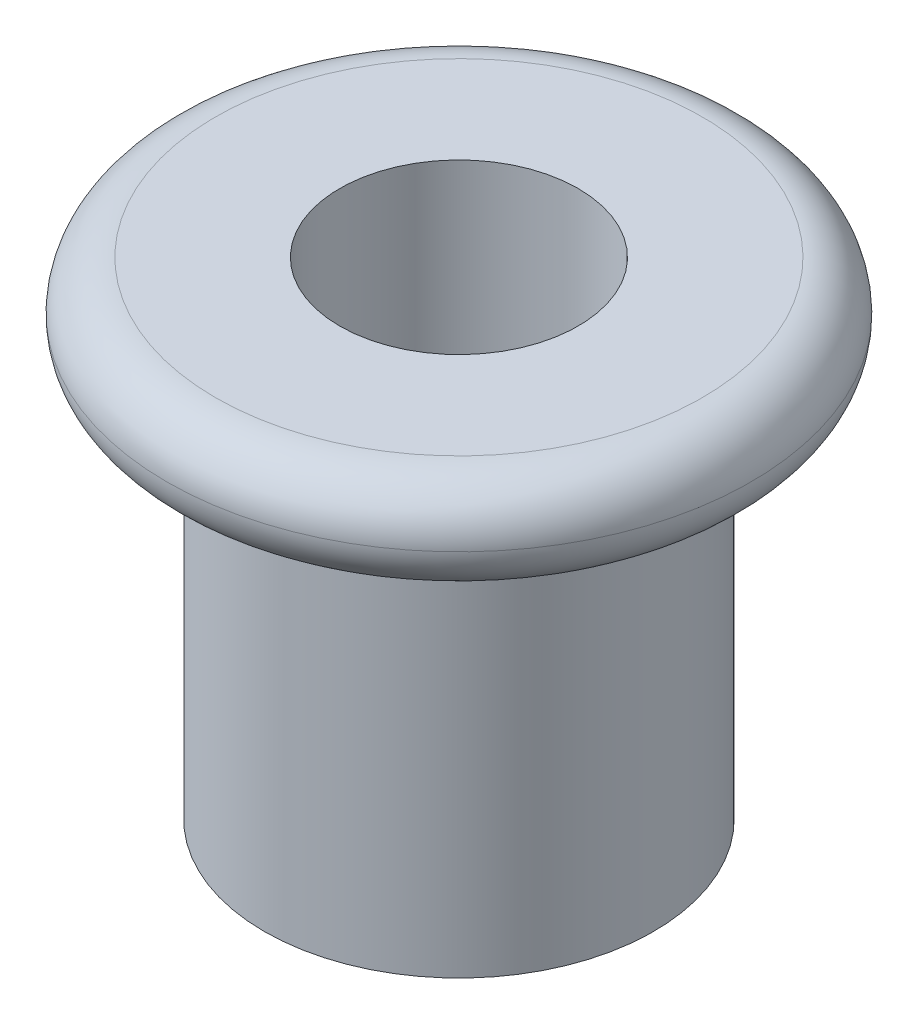
ISO-10303-21;
HEADER;
FILE_DESCRIPTION(('STEP AP214'),'2;1');
FILE_NAME('part.step','',(''),(''),'','','');
FILE_SCHEMA(('AUTOMOTIVE_DESIGN { 1 0 10303 214 1 1 1 1 }'));
ENDSEC;
DATA;
#1=APPLICATION_CONTEXT('core data for automotive mechanical design processes');
#2=APPLICATION_PROTOCOL_DEFINITION('international standard','automotive_design',2000,#1);
#3=PRODUCT_CONTEXT('',#1,'mechanical');
#4=PRODUCT('Part','Part','',(#3));
#5=PRODUCT_RELATED_PRODUCT_CATEGORY('part','',(#4));
#6=PRODUCT_DEFINITION_FORMATION('','',#4);
#7=PRODUCT_DEFINITION_CONTEXT('part definition',#1,'design');
#8=PRODUCT_DEFINITION('design','',#6,#7);
#9=PRODUCT_DEFINITION_SHAPE('','',#8);
#10=(LENGTH_UNIT() NAMED_UNIT(*) SI_UNIT(.MILLI.,.METRE.));
#11=(NAMED_UNIT(*) PLANE_ANGLE_UNIT() SI_UNIT($,.RADIAN.));
#12=(NAMED_UNIT(*) SI_UNIT($,.STERADIAN.) SOLID_ANGLE_UNIT());
#13=UNCERTAINTY_MEASURE_WITH_UNIT(LENGTH_MEASURE(1.E-05),#10,'distance_accuracy_value','');
#14=(GEOMETRIC_REPRESENTATION_CONTEXT(3) GLOBAL_UNCERTAINTY_ASSIGNED_CONTEXT((#13)) GLOBAL_UNIT_ASSIGNED_CONTEXT((#10,
#11,#12)) REPRESENTATION_CONTEXT('',''));
#15=CARTESIAN_POINT('',(0.,0.,0.));
#16=DIRECTION('',(0.,0.,1.));
#17=DIRECTION('',(1.,0.,0.));
#18=AXIS2_PLACEMENT_3D('',#15,#16,#17);
#19=CARTESIAN_POINT('',(0.,0.,0.));
#20=DIRECTION('',(0.,1.,0.));
#21=DIRECTION('',(0.,0.,1.));
#22=AXIS2_PLACEMENT_3D('',#19,#20,#21);
#23=PLANE('',#22);
#24=CARTESIAN_POINT('',(0.,0.,0.));
#25=DIRECTION('',(0.,1.,0.));
#26=DIRECTION('',(0.,0.,1.));
#27=AXIS2_PLACEMENT_3D('',#24,#25,#26);
#28=CIRCLE('',#27,3.45);
#29=CARTESIAN_POINT('',(0.,0.,3.45));
#30=VERTEX_POINT('',#29);
#31=EDGE_CURVE('E37',#30,#30,#28,.T.);
#32=ORIENTED_EDGE('',*,*,#31,.T.);
#33=EDGE_LOOP('',(#32));
#34=FACE_BOUND('',#33,.T.);
#35=CARTESIAN_POINT('',(0.,0.,0.));
#36=DIRECTION('',(0.,1.,0.));
#37=DIRECTION('',(0.,0.,1.));
#38=AXIS2_PLACEMENT_3D('',#35,#36,#37);
#39=CIRCLE('',#38,4.);
#40=CARTESIAN_POINT('',(0.,0.,4.));
#41=VERTEX_POINT('',#40);
#42=EDGE_CURVE('E50',#41,#41,#39,.T.);
#43=ORIENTED_EDGE('',*,*,#42,.F.);
#44=EDGE_LOOP('',(#43));
#45=FACE_BOUND('',#44,.T.);
#46=ADVANCED_FACE('F30',(#34,#45),#23,.F.);
#47=CARTESIAN_POINT('',(0.,8.,0.));
#48=DIRECTION('',(0.,-1.,0.));
#49=DIRECTION('',(0.,0.,-1.));
#50=AXIS2_PLACEMENT_3D('',#47,#48,#49);
#51=CYLINDRICAL_SURFACE('',#50,4.);
#52=CARTESIAN_POINT('',(0.,8.,0.));
#53=DIRECTION('',(0.,1.,0.));
#54=DIRECTION('',(0.,0.,1.));
#55=AXIS2_PLACEMENT_3D('',#52,#53,#54);
#56=CIRCLE('',#55,4.);
#57=CARTESIAN_POINT('',(0.,8.,4.));
#58=VERTEX_POINT('',#57);
#59=EDGE_CURVE('E55',#58,#58,#56,.T.);
#60=ORIENTED_EDGE('',*,*,#59,.F.);
#61=EDGE_LOOP('',(#60));
#62=FACE_BOUND('',#61,.T.);
#63=ORIENTED_EDGE('',*,*,#42,.T.);
#64=EDGE_LOOP('',(#63));
#65=FACE_BOUND('',#64,.T.);
#66=ADVANCED_FACE('F88',(#62,#65),#51,.T.);
#67=CARTESIAN_POINT('',(0.,8.,0.));
#68=DIRECTION('',(0.,-1.,0.));
#69=DIRECTION('',(0.,0.,-1.));
#70=AXIS2_PLACEMENT_3D('',#67,#68,#69);
#71=CYLINDRICAL_SURFACE('',#70,2.45);
#72=CARTESIAN_POINT('',(0.,1.,0.));
#73=DIRECTION('',(0.,1.,0.));
#74=DIRECTION('',(0.,0.,1.));
#75=AXIS2_PLACEMENT_3D('',#72,#73,#74);
#76=CIRCLE('',#75,2.45);
#77=CARTESIAN_POINT('',(0.,1.,2.45));
#78=VERTEX_POINT('',#77);
#79=EDGE_CURVE('E10',#78,#78,#76,.F.);
#80=ORIENTED_EDGE('',*,*,#79,.T.);
#81=EDGE_LOOP('',(#80));
#82=FACE_BOUND('',#81,.T.);
#83=CARTESIAN_POINT('',(0.,10.,0.));
#84=DIRECTION('',(0.,1.,0.));
#85=DIRECTION('',(0.,0.,1.));
#86=AXIS2_PLACEMENT_3D('',#83,#84,#85);
#87=CIRCLE('',#86,2.45);
#88=CARTESIAN_POINT('',(0.,10.,2.45));
#89=VERTEX_POINT('',#88);
#90=EDGE_CURVE('E51',#89,#89,#87,.T.);
#91=ORIENTED_EDGE('',*,*,#90,.T.);
#92=EDGE_LOOP('',(#91));
#93=FACE_BOUND('',#92,.T.);
#94=ADVANCED_FACE('F63',(#82,#93),#71,.F.);
#95=CARTESIAN_POINT('',(0.,10.,0.));
#96=DIRECTION('',(0.,1.,0.));
#97=DIRECTION('',(0.,0.,1.));
#98=AXIS2_PLACEMENT_3D('',#95,#96,#97);
#99=PLANE('',#98);
#100=ORIENTED_EDGE('',*,*,#90,.F.);
#101=EDGE_LOOP('',(#100));
#102=FACE_BOUND('',#101,.T.);
#103=CARTESIAN_POINT('',(0.,10.,0.));
#104=DIRECTION('',(0.,1.,0.));
#105=DIRECTION('',(0.,0.,1.));
#106=AXIS2_PLACEMENT_3D('',#103,#104,#105);
#107=CIRCLE('',#106,5.);
#108=CARTESIAN_POINT('',(0.,10.,5.));
#109=VERTEX_POINT('',#108);
#110=EDGE_CURVE('E41',#109,#109,#107,.T.);
#111=ORIENTED_EDGE('',*,*,#110,.T.);
#112=EDGE_LOOP('',(#111));
#113=FACE_BOUND('',#112,.T.);
#114=ADVANCED_FACE('F65',(#102,#113),#99,.T.);
#115=CARTESIAN_POINT('',(0.,8.,0.));
#116=DIRECTION('',(0.,1.,0.));
#117=DIRECTION('',(0.,0.,1.));
#118=AXIS2_PLACEMENT_3D('',#115,#116,#117);
#119=PLANE('',#118);
#120=CARTESIAN_POINT('',(0.,8.,0.));
#121=DIRECTION('',(0.,1.,0.));
#122=DIRECTION('',(0.,0.,1.));
#123=AXIS2_PLACEMENT_3D('',#120,#121,#122);
#124=CIRCLE('',#123,5.);
#125=CARTESIAN_POINT('',(0.,8.,5.));
#126=VERTEX_POINT('',#125);
#127=EDGE_CURVE('E45',#126,#126,#124,.F.);
#128=ORIENTED_EDGE('',*,*,#127,.T.);
#129=EDGE_LOOP('',(#128));
#130=FACE_BOUND('',#129,.T.);
#131=ORIENTED_EDGE('',*,*,#59,.T.);
#132=EDGE_LOOP('',(#131));
#133=FACE_BOUND('',#132,.T.);
#134=ADVANCED_FACE('F68',(#130,#133),#119,.F.);
#135=CARTESIAN_POINT('',(0.,9.,0.));
#136=DIRECTION('',(0.,1.,0.));
#137=DIRECTION('',(0.,0.,1.));
#138=AXIS2_PLACEMENT_3D('',#135,#136,#137);
#139=TOROIDAL_SURFACE('',#138,5.,1.);
#140=ORIENTED_EDGE('',*,*,#110,.F.);
#141=EDGE_LOOP('',(#140));
#142=FACE_BOUND('',#141,.T.);
#143=CARTESIAN_POINT('',(0.,9.,0.));
#144=DIRECTION('',(0.,1.,0.));
#145=DIRECTION('',(0.,0.,1.));
#146=AXIS2_PLACEMENT_3D('',#143,#144,#145);
#147=CIRCLE('',#146,6.);
#148=CARTESIAN_POINT('',(0.,9.,6.));
#149=VERTEX_POINT('',#148);
#150=EDGE_CURVE('E48',#149,#149,#147,.F.);
#151=ORIENTED_EDGE('',*,*,#150,.F.);
#152=EDGE_LOOP('',(#151));
#153=FACE_BOUND('',#152,.T.);
#154=ADVANCED_FACE('F72',(#142,#153),#139,.T.);
#155=CARTESIAN_POINT('',(0.,9.,0.));
#156=DIRECTION('',(0.,1.,0.));
#157=DIRECTION('',(0.,0.,1.));
#158=AXIS2_PLACEMENT_3D('',#155,#156,#157);
#159=TOROIDAL_SURFACE('',#158,5.,1.);
#160=ORIENTED_EDGE('',*,*,#127,.F.);
#161=EDGE_LOOP('',(#160));
#162=FACE_BOUND('',#161,.T.);
#163=ORIENTED_EDGE('',*,*,#150,.T.);
#164=EDGE_LOOP('',(#163));
#165=FACE_BOUND('',#164,.T.);
#166=ADVANCED_FACE('F75',(#162,#165),#159,.T.);
#167=CARTESIAN_POINT('',(0.,0.,0.));
#168=DIRECTION('',(0.,-1.,0.));
#169=DIRECTION('',(0.,0.,-1.));
#170=AXIS2_PLACEMENT_3D('',#167,#168,#169);
#171=CONICAL_SURFACE('',#170,3.45,0.785398163397446);
#172=ORIENTED_EDGE('',*,*,#79,.F.);
#173=EDGE_LOOP('',(#172));
#174=FACE_BOUND('',#173,.T.);
#175=ORIENTED_EDGE('',*,*,#31,.F.);
#176=EDGE_LOOP('',(#175));
#177=FACE_BOUND('',#176,.T.);
#178=ADVANCED_FACE('F32',(#174,#177),#171,.F.);
#179=CLOSED_SHELL('',(#46,#66,#94,#114,#134,#154,#166,#178));
#180=MANIFOLD_SOLID_BREP('B2',#179);
#181=ADVANCED_BREP_SHAPE_REPRESENTATION('',(#18,#180),#14);
#182=SHAPE_DEFINITION_REPRESENTATION(#9,#181);
ENDSEC;
END-ISO-10303-21;
